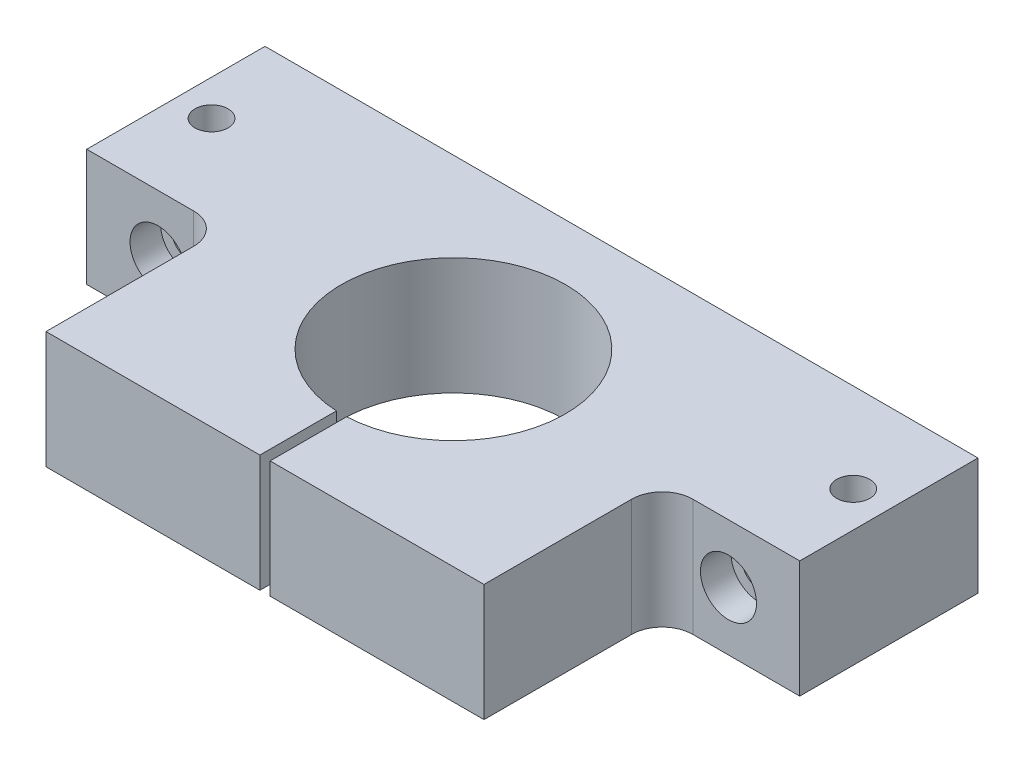
ISO-10303-21;
HEADER;
FILE_DESCRIPTION(('STEP AP214'),'2;1');
FILE_NAME('part.step','',(''),(''),'','','');
FILE_SCHEMA(('AUTOMOTIVE_DESIGN { 1 0 10303 214 1 1 1 1 }'));
ENDSEC;
DATA;
#1=APPLICATION_CONTEXT('core data for automotive mechanical design processes');
#2=APPLICATION_PROTOCOL_DEFINITION('international standard','automotive_design',2000,#1);
#3=PRODUCT_CONTEXT('',#1,'mechanical');
#4=PRODUCT('Part','Part','',(#3));
#5=PRODUCT_RELATED_PRODUCT_CATEGORY('part','',(#4));
#6=PRODUCT_DEFINITION_FORMATION('','',#4);
#7=PRODUCT_DEFINITION_CONTEXT('part definition',#1,'design');
#8=PRODUCT_DEFINITION('design','',#6,#7);
#9=PRODUCT_DEFINITION_SHAPE('','',#8);
#10=(LENGTH_UNIT() NAMED_UNIT(*) SI_UNIT(.MILLI.,.METRE.));
#11=(NAMED_UNIT(*) PLANE_ANGLE_UNIT() SI_UNIT($,.RADIAN.));
#12=(NAMED_UNIT(*) SI_UNIT($,.STERADIAN.) SOLID_ANGLE_UNIT());
#13=UNCERTAINTY_MEASURE_WITH_UNIT(LENGTH_MEASURE(1.E-05),#10,'distance_accuracy_value','');
#14=(GEOMETRIC_REPRESENTATION_CONTEXT(3) GLOBAL_UNCERTAINTY_ASSIGNED_CONTEXT((#13)) GLOBAL_UNIT_ASSIGNED_CONTEXT((#10,
#11,#12)) REPRESENTATION_CONTEXT('',''));
#15=CARTESIAN_POINT('',(0.,0.,0.));
#16=DIRECTION('',(0.,0.,1.));
#17=DIRECTION('',(1.,0.,0.));
#18=AXIS2_PLACEMENT_3D('',#15,#16,#17);
#19=CARTESIAN_POINT('',(69.,23.,0.));
#20=DIRECTION('',(1.,0.,0.));
#21=DIRECTION('',(0.,0.,-1.));
#22=AXIS2_PLACEMENT_3D('',#19,#20,#21);
#23=PLANE('',#22);
#24=DIRECTION('',(0.,0.,1.));
#25=VECTOR('',#24,1.);
#26=CARTESIAN_POINT('',(69.,0.,0.));
#27=LINE('',#26,#25);
#28=CARTESIAN_POINT('',(69.,0.,54.9772609758359));
#29=VERTEX_POINT('',#28);
#30=CARTESIAN_POINT('',(69.,0.,70.));
#31=VERTEX_POINT('',#30);
#32=EDGE_CURVE('E174',#29,#31,#27,.T.);
#33=ORIENTED_EDGE('',*,*,#32,.F.);
#34=DIRECTION('',(0.,-1.,0.));
#35=VECTOR('',#34,1.);
#36=CARTESIAN_POINT('',(69.,23.,54.9772609758359));
#37=LINE('',#36,#35);
#38=CARTESIAN_POINT('',(69.,23.,54.9772609758359));
#39=VERTEX_POINT('',#38);
#40=EDGE_CURVE('E200',#39,#29,#37,.T.);
#41=ORIENTED_EDGE('',*,*,#40,.F.);
#42=DIRECTION('',(0.,0.,1.));
#43=VECTOR('',#42,1.);
#44=CARTESIAN_POINT('',(69.,23.,0.));
#45=LINE('',#44,#43);
#46=CARTESIAN_POINT('',(69.,23.,70.));
#47=VERTEX_POINT('',#46);
#48=EDGE_CURVE('E197',#39,#47,#45,.T.);
#49=ORIENTED_EDGE('',*,*,#48,.T.);
#50=DIRECTION('',(0.,-1.,0.));
#51=VECTOR('',#50,1.);
#52=CARTESIAN_POINT('',(69.,23.,70.));
#53=LINE('',#52,#51);
#54=EDGE_CURVE('E230',#47,#31,#53,.T.);
#55=ORIENTED_EDGE('',*,*,#54,.T.);
#56=EDGE_LOOP('',(#33,#41,#49,#55));
#57=FACE_BOUND('',#56,.T.);
#58=CARTESIAN_POINT('',(69.,11.5,63.));
#59=DIRECTION('',(1.,0.,0.));
#60=DIRECTION('',(0.,0.,-1.));
#61=AXIS2_PLACEMENT_3D('',#58,#59,#60);
#62=CIRCLE('',#61,3.24999999999999);
#63=CARTESIAN_POINT('',(69.,11.5,59.75));
#64=VERTEX_POINT('',#63);
#65=EDGE_CURVE('E154',#64,#64,#62,.F.);
#66=ORIENTED_EDGE('',*,*,#65,.T.);
#67=EDGE_LOOP('',(#66));
#68=FACE_BOUND('',#67,.T.);
#69=ADVANCED_FACE('F38',(#57,#68),#23,.T.);
#70=CARTESIAN_POINT('',(70.,23.,33.));
#71=DIRECTION('',(0.,-1.,0.));
#72=DIRECTION('',(0.,0.,-1.));
#73=AXIS2_PLACEMENT_3D('',#70,#71,#72);
#74=CYLINDRICAL_SURFACE('',#73,22.);
#75=CARTESIAN_POINT('',(70.,0.,33.));
#76=DIRECTION('',(0.,1.,0.));
#77=DIRECTION('',(0.,0.,1.));
#78=AXIS2_PLACEMENT_3D('',#75,#76,#77);
#79=CIRCLE('',#78,22.);
#80=CARTESIAN_POINT('',(71.,0.,54.9772609758359));
#81=VERTEX_POINT('',#80);
#82=EDGE_CURVE('E166',#81,#29,#79,.T.);
#83=ORIENTED_EDGE('',*,*,#82,.F.);
#84=DIRECTION('',(0.,-1.,0.));
#85=VECTOR('',#84,1.);
#86=CARTESIAN_POINT('',(71.,23.,54.9772609758359));
#87=LINE('',#86,#85);
#88=CARTESIAN_POINT('',(71.,23.,54.9772609758359));
#89=VERTEX_POINT('',#88);
#90=EDGE_CURVE('E251',#89,#81,#87,.T.);
#91=ORIENTED_EDGE('',*,*,#90,.F.);
#92=CARTESIAN_POINT('',(70.,23.,33.));
#93=DIRECTION('',(0.,1.,0.));
#94=DIRECTION('',(0.,0.,1.));
#95=AXIS2_PLACEMENT_3D('',#92,#93,#94);
#96=CIRCLE('',#95,22.);
#97=EDGE_CURVE('E170',#89,#39,#96,.T.);
#98=ORIENTED_EDGE('',*,*,#97,.T.);
#99=ORIENTED_EDGE('',*,*,#40,.T.);
#100=EDGE_LOOP('',(#83,#91,#98,#99));
#101=FACE_BOUND('',#100,.T.);
#102=ADVANCED_FACE('F295',(#101),#74,.F.);
#103=CARTESIAN_POINT('',(70.9999999999999,23.,0.));
#104=DIRECTION('',(1.,0.,0.));
#105=DIRECTION('',(0.,0.,-1.));
#106=AXIS2_PLACEMENT_3D('',#103,#104,#105);
#107=PLANE('',#106);
#108=CARTESIAN_POINT('',(70.9999999999999,11.5,62.9999999999999));
#109=DIRECTION('',(-1.,0.,0.));
#110=DIRECTION('',(0.,0.,1.));
#111=AXIS2_PLACEMENT_3D('',#108,#109,#110);
#112=CIRCLE('',#111,2.5);
#113=CARTESIAN_POINT('',(70.9999999999999,11.5,65.4999999999999));
#114=VERTEX_POINT('',#113);
#115=EDGE_CURVE('E151',#114,#114,#112,.T.);
#116=ORIENTED_EDGE('',*,*,#115,.F.);
#117=EDGE_LOOP('',(#116));
#118=FACE_BOUND('',#117,.T.);
#119=DIRECTION('',(0.,0.,1.));
#120=VECTOR('',#119,1.);
#121=CARTESIAN_POINT('',(70.9999999999999,0.,0.));
#122=LINE('',#121,#120);
#123=CARTESIAN_POINT('',(71.,0.,70.));
#124=VERTEX_POINT('',#123);
#125=EDGE_CURVE('E203',#81,#124,#122,.T.);
#126=ORIENTED_EDGE('',*,*,#125,.T.);
#127=DIRECTION('',(0.,-1.,0.));
#128=VECTOR('',#127,1.);
#129=CARTESIAN_POINT('',(71.,23.,70.));
#130=LINE('',#129,#128);
#131=CARTESIAN_POINT('',(71.,23.,70.));
#132=VERTEX_POINT('',#131);
#133=EDGE_CURVE('E248',#132,#124,#130,.T.);
#134=ORIENTED_EDGE('',*,*,#133,.F.);
#135=DIRECTION('',(0.,0.,1.));
#136=VECTOR('',#135,1.);
#137=CARTESIAN_POINT('',(70.9999999999999,23.,0.));
#138=LINE('',#137,#136);
#139=EDGE_CURVE('E173',#89,#132,#138,.T.);
#140=ORIENTED_EDGE('',*,*,#139,.F.);
#141=ORIENTED_EDGE('',*,*,#90,.T.);
#142=EDGE_LOOP('',(#126,#134,#140,#141));
#143=FACE_BOUND('',#142,.T.);
#144=ADVANCED_FACE('F340',(#118,#143),#107,.F.);
#145=CARTESIAN_POINT('',(0.,23.,70.));
#146=DIRECTION('',(0.,0.,-1.));
#147=DIRECTION('',(-1.,0.,0.));
#148=AXIS2_PLACEMENT_3D('',#145,#146,#147);
#149=PLANE('',#148);
#150=DIRECTION('',(1.,0.,0.));
#151=VECTOR('',#150,1.);
#152=CARTESIAN_POINT('',(0.,0.,70.));
#153=LINE('',#152,#151);
#154=CARTESIAN_POINT('',(113.,0.,70.));
#155=VERTEX_POINT('',#154);
#156=EDGE_CURVE('E205',#124,#155,#153,.T.);
#157=ORIENTED_EDGE('',*,*,#156,.T.);
#158=DIRECTION('',(0.,-1.,0.));
#159=VECTOR('',#158,1.);
#160=CARTESIAN_POINT('',(113.,23.,70.));
#161=LINE('',#160,#159);
#162=CARTESIAN_POINT('',(113.,23.,70.));
#163=VERTEX_POINT('',#162);
#164=EDGE_CURVE('E245',#163,#155,#161,.T.);
#165=ORIENTED_EDGE('',*,*,#164,.F.);
#166=DIRECTION('',(1.,0.,0.));
#167=VECTOR('',#166,1.);
#168=CARTESIAN_POINT('',(0.,23.,70.));
#169=LINE('',#168,#167);
#170=EDGE_CURVE('E176',#132,#163,#169,.T.);
#171=ORIENTED_EDGE('',*,*,#170,.F.);
#172=ORIENTED_EDGE('',*,*,#133,.T.);
#173=EDGE_LOOP('',(#157,#165,#171,#172));
#174=FACE_BOUND('',#173,.T.);
#175=ADVANCED_FACE('F288',(#174),#149,.F.);
#176=CARTESIAN_POINT('',(113.,23.,0.));
#177=DIRECTION('',(-1.,0.,0.));
#178=DIRECTION('',(0.,0.,1.));
#179=AXIS2_PLACEMENT_3D('',#176,#177,#178);
#180=PLANE('',#179);
#181=DIRECTION('',(0.,0.,-1.));
#182=VECTOR('',#181,1.);
#183=CARTESIAN_POINT('',(113.,0.,0.));
#184=LINE('',#183,#182);
#185=CARTESIAN_POINT('',(113.,0.,41.));
#186=VERTEX_POINT('',#185);
#187=EDGE_CURVE('E207',#155,#186,#184,.T.);
#188=ORIENTED_EDGE('',*,*,#187,.T.);
#189=DIRECTION('',(0.,-1.,0.));
#190=VECTOR('',#189,1.);
#191=CARTESIAN_POINT('',(113.,23.,41.));
#192=LINE('',#191,#190);
#193=CARTESIAN_POINT('',(113.,23.,41.));
#194=VERTEX_POINT('',#193);
#195=EDGE_CURVE('E256',#186,#194,#192,.F.);
#196=ORIENTED_EDGE('',*,*,#195,.T.);
#197=DIRECTION('',(0.,0.,-1.));
#198=VECTOR('',#197,1.);
#199=CARTESIAN_POINT('',(113.,23.,0.));
#200=LINE('',#199,#198);
#201=EDGE_CURVE('E178',#163,#194,#200,.T.);
#202=ORIENTED_EDGE('',*,*,#201,.F.);
#203=ORIENTED_EDGE('',*,*,#164,.T.);
#204=EDGE_LOOP('',(#188,#196,#202,#203));
#205=FACE_BOUND('',#204,.T.);
#206=ADVANCED_FACE('F284',(#205),#180,.F.);
#207=CARTESIAN_POINT('',(0.,23.,35.));
#208=DIRECTION('',(0.,0.,-1.));
#209=DIRECTION('',(-1.,0.,0.));
#210=AXIS2_PLACEMENT_3D('',#207,#208,#209);
#211=PLANE('',#210);
#212=CARTESIAN_POINT('',(126.,11.5,35.));
#213=DIRECTION('',(0.,0.,1.));
#214=DIRECTION('',(1.,0.,0.));
#215=AXIS2_PLACEMENT_3D('',#212,#213,#214);
#216=CIRCLE('',#215,5.50000000000001);
#217=CARTESIAN_POINT('',(131.5,11.5,35.));
#218=VERTEX_POINT('',#217);
#219=EDGE_CURVE('E680',#218,#218,#216,.T.);
#220=ORIENTED_EDGE('',*,*,#219,.F.);
#221=EDGE_LOOP('',(#220));
#222=FACE_BOUND('',#221,.T.);
#223=DIRECTION('',(1.,0.,0.));
#224=VECTOR('',#223,1.);
#225=CARTESIAN_POINT('',(0.,23.,35.));
#226=LINE('',#225,#224);
#227=CARTESIAN_POINT('',(119.,23.,35.));
#228=VERTEX_POINT('',#227);
#229=CARTESIAN_POINT('',(140.,23.,35.));
#230=VERTEX_POINT('',#229);
#231=EDGE_CURVE('E181',#228,#230,#226,.T.);
#232=ORIENTED_EDGE('',*,*,#231,.F.);
#233=DIRECTION('',(0.,-1.,0.));
#234=VECTOR('',#233,1.);
#235=CARTESIAN_POINT('',(119.,0.,35.));
#236=LINE('',#235,#234);
#237=CARTESIAN_POINT('',(119.,0.,35.));
#238=VERTEX_POINT('',#237);
#239=EDGE_CURVE('E253',#228,#238,#236,.T.);
#240=ORIENTED_EDGE('',*,*,#239,.T.);
#241=DIRECTION('',(1.,0.,0.));
#242=VECTOR('',#241,1.);
#243=CARTESIAN_POINT('',(0.,0.,35.));
#244=LINE('',#243,#242);
#245=CARTESIAN_POINT('',(140.,0.,35.));
#246=VERTEX_POINT('',#245);
#247=EDGE_CURVE('E210',#238,#246,#244,.T.);
#248=ORIENTED_EDGE('',*,*,#247,.T.);
#249=DIRECTION('',(0.,-1.,0.));
#250=VECTOR('',#249,1.);
#251=CARTESIAN_POINT('',(140.,23.,35.));
#252=LINE('',#251,#250);
#253=EDGE_CURVE('E242',#230,#246,#252,.T.);
#254=ORIENTED_EDGE('',*,*,#253,.F.);
#255=EDGE_LOOP('',(#232,#240,#248,#254));
#256=FACE_BOUND('',#255,.T.);
#257=ADVANCED_FACE('F277',(#222,#256),#211,.F.);
#258=CARTESIAN_POINT('',(140.,23.,0.));
#259=DIRECTION('',(1.,0.,0.));
#260=DIRECTION('',(0.,0.,-1.));
#261=AXIS2_PLACEMENT_3D('',#258,#259,#260);
#262=PLANE('',#261);
#263=DIRECTION('',(0.,0.,1.));
#264=VECTOR('',#263,1.);
#265=CARTESIAN_POINT('',(140.,0.,0.));
#266=LINE('',#265,#264);
#267=CARTESIAN_POINT('',(140.,0.,0.));
#268=VERTEX_POINT('',#267);
#269=EDGE_CURVE('E212',#268,#246,#266,.T.);
#270=ORIENTED_EDGE('',*,*,#269,.F.);
#271=DIRECTION('',(0.,-1.,0.));
#272=VECTOR('',#271,1.);
#273=CARTESIAN_POINT('',(140.,23.,0.));
#274=LINE('',#273,#272);
#275=CARTESIAN_POINT('',(140.,23.,0.));
#276=VERTEX_POINT('',#275);
#277=EDGE_CURVE('E240',#276,#268,#274,.T.);
#278=ORIENTED_EDGE('',*,*,#277,.F.);
#279=DIRECTION('',(0.,0.,1.));
#280=VECTOR('',#279,1.);
#281=CARTESIAN_POINT('',(140.,23.,0.));
#282=LINE('',#281,#280);
#283=EDGE_CURVE('E183',#276,#230,#282,.T.);
#284=ORIENTED_EDGE('',*,*,#283,.T.);
#285=ORIENTED_EDGE('',*,*,#253,.T.);
#286=EDGE_LOOP('',(#270,#278,#284,#285));
#287=FACE_BOUND('',#286,.T.);
#288=ADVANCED_FACE('F323',(#287),#262,.T.);
#289=CARTESIAN_POINT('',(0.,23.,0.));
#290=DIRECTION('',(0.,0.,-1.));
#291=DIRECTION('',(-1.,0.,0.));
#292=AXIS2_PLACEMENT_3D('',#289,#290,#291);
#293=PLANE('',#292);
#294=CARTESIAN_POINT('',(14.,11.5,0.));
#295=DIRECTION('',(0.,0.,1.));
#296=DIRECTION('',(1.,0.,0.));
#297=AXIS2_PLACEMENT_3D('',#294,#295,#296);
#298=CIRCLE('',#297,3.29999999999999);
#299=CARTESIAN_POINT('',(17.3,11.5,0.));
#300=VERTEX_POINT('',#299);
#301=EDGE_CURVE('E677',#300,#300,#298,.T.);
#302=ORIENTED_EDGE('',*,*,#301,.T.);
#303=EDGE_LOOP('',(#302));
#304=FACE_BOUND('',#303,.T.);
#305=CARTESIAN_POINT('',(126.,11.5,0.));
#306=DIRECTION('',(0.,0.,1.));
#307=DIRECTION('',(1.,0.,0.));
#308=AXIS2_PLACEMENT_3D('',#305,#306,#307);
#309=CIRCLE('',#308,3.3);
#310=CARTESIAN_POINT('',(129.3,11.5,0.));
#311=VERTEX_POINT('',#310);
#312=EDGE_CURVE('E157',#311,#311,#309,.T.);
#313=ORIENTED_EDGE('',*,*,#312,.T.);
#314=EDGE_LOOP('',(#313));
#315=FACE_BOUND('',#314,.T.);
#316=DIRECTION('',(1.,0.,0.));
#317=VECTOR('',#316,1.);
#318=CARTESIAN_POINT('',(0.,0.,0.));
#319=LINE('',#318,#317);
#320=CARTESIAN_POINT('',(0.,0.,0.));
#321=VERTEX_POINT('',#320);
#322=EDGE_CURVE('E215',#321,#268,#319,.T.);
#323=ORIENTED_EDGE('',*,*,#322,.F.);
#324=DIRECTION('',(0.,-1.,0.));
#325=VECTOR('',#324,1.);
#326=CARTESIAN_POINT('',(0.,23.,0.));
#327=LINE('',#326,#325);
#328=CARTESIAN_POINT('',(0.,23.,0.));
#329=VERTEX_POINT('',#328);
#330=EDGE_CURVE('E238',#329,#321,#327,.T.);
#331=ORIENTED_EDGE('',*,*,#330,.F.);
#332=DIRECTION('',(1.,0.,0.));
#333=VECTOR('',#332,1.);
#334=CARTESIAN_POINT('',(0.,23.,0.));
#335=LINE('',#334,#333);
#336=EDGE_CURVE('E186',#329,#276,#335,.T.);
#337=ORIENTED_EDGE('',*,*,#336,.T.);
#338=ORIENTED_EDGE('',*,*,#277,.T.);
#339=EDGE_LOOP('',(#323,#331,#337,#338));
#340=FACE_BOUND('',#339,.T.);
#341=ADVANCED_FACE('F320',(#304,#315,#340),#293,.T.);
#342=CARTESIAN_POINT('',(0.,23.,0.));
#343=DIRECTION('',(1.,0.,0.));
#344=DIRECTION('',(0.,0.,-1.));
#345=AXIS2_PLACEMENT_3D('',#342,#343,#344);
#346=PLANE('',#345);
#347=DIRECTION('',(0.,0.,1.));
#348=VECTOR('',#347,1.);
#349=CARTESIAN_POINT('',(0.,0.,0.));
#350=LINE('',#349,#348);
#351=CARTESIAN_POINT('',(0.,0.,35.));
#352=VERTEX_POINT('',#351);
#353=EDGE_CURVE('E218',#321,#352,#350,.T.);
#354=ORIENTED_EDGE('',*,*,#353,.T.);
#355=DIRECTION('',(0.,-1.,0.));
#356=VECTOR('',#355,1.);
#357=CARTESIAN_POINT('',(0.,23.,35.));
#358=LINE('',#357,#356);
#359=CARTESIAN_POINT('',(0.,23.,35.));
#360=VERTEX_POINT('',#359);
#361=EDGE_CURVE('E235',#360,#352,#358,.T.);
#362=ORIENTED_EDGE('',*,*,#361,.F.);
#363=DIRECTION('',(0.,0.,1.));
#364=VECTOR('',#363,1.);
#365=CARTESIAN_POINT('',(0.,23.,0.));
#366=LINE('',#365,#364);
#367=EDGE_CURVE('E189',#329,#360,#366,.T.);
#368=ORIENTED_EDGE('',*,*,#367,.F.);
#369=ORIENTED_EDGE('',*,*,#330,.T.);
#370=EDGE_LOOP('',(#354,#362,#368,#369));
#371=FACE_BOUND('',#370,.T.);
#372=ADVANCED_FACE('F330',(#371),#346,.F.);
#373=CARTESIAN_POINT('',(0.,23.,35.));
#374=DIRECTION('',(0.,0.,-1.));
#375=DIRECTION('',(-1.,0.,0.));
#376=AXIS2_PLACEMENT_3D('',#373,#374,#375);
#377=PLANE('',#376);
#378=CARTESIAN_POINT('',(14.,11.5,35.));
#379=DIRECTION('',(0.,0.,1.));
#380=DIRECTION('',(1.,0.,0.));
#381=AXIS2_PLACEMENT_3D('',#378,#379,#380);
#382=CIRCLE('',#381,5.49999999999999);
#383=CARTESIAN_POINT('',(19.5,11.5,35.));
#384=VERTEX_POINT('',#383);
#385=EDGE_CURVE('E668',#384,#384,#382,.T.);
#386=ORIENTED_EDGE('',*,*,#385,.F.);
#387=EDGE_LOOP('',(#386));
#388=FACE_BOUND('',#387,.T.);
#389=DIRECTION('',(1.,0.,0.));
#390=VECTOR('',#389,1.);
#391=CARTESIAN_POINT('',(0.,0.,35.));
#392=LINE('',#391,#390);
#393=CARTESIAN_POINT('',(21.,0.,35.));
#394=VERTEX_POINT('',#393);
#395=EDGE_CURVE('E220',#352,#394,#392,.T.);
#396=ORIENTED_EDGE('',*,*,#395,.T.);
#397=DIRECTION('',(0.,-1.,0.));
#398=VECTOR('',#397,1.);
#399=CARTESIAN_POINT('',(21.,23.,35.));
#400=LINE('',#399,#398);
#401=CARTESIAN_POINT('',(21.,23.,35.));
#402=VERTEX_POINT('',#401);
#403=EDGE_CURVE('E53',#394,#402,#400,.F.);
#404=ORIENTED_EDGE('',*,*,#403,.T.);
#405=DIRECTION('',(1.,0.,0.));
#406=VECTOR('',#405,1.);
#407=CARTESIAN_POINT('',(0.,23.,35.));
#408=LINE('',#407,#406);
#409=EDGE_CURVE('E191',#360,#402,#408,.T.);
#410=ORIENTED_EDGE('',*,*,#409,.F.);
#411=ORIENTED_EDGE('',*,*,#361,.T.);
#412=EDGE_LOOP('',(#396,#404,#410,#411));
#413=FACE_BOUND('',#412,.T.);
#414=ADVANCED_FACE('F315',(#388,#413),#377,.F.);
#415=CARTESIAN_POINT('',(27.,23.,0.));
#416=DIRECTION('',(1.,0.,0.));
#417=DIRECTION('',(0.,0.,-1.));
#418=AXIS2_PLACEMENT_3D('',#415,#416,#417);
#419=PLANE('',#418);
#420=CARTESIAN_POINT('',(27.,11.5,63.));
#421=DIRECTION('',(-1.,0.,0.));
#422=DIRECTION('',(0.,0.,1.));
#423=AXIS2_PLACEMENT_3D('',#420,#421,#422);
#424=CIRCLE('',#423,5.5);
#425=CARTESIAN_POINT('',(27.,11.5,68.5));
#426=VERTEX_POINT('',#425);
#427=EDGE_CURVE('E150',#426,#426,#424,.T.);
#428=ORIENTED_EDGE('',*,*,#427,.F.);
#429=EDGE_LOOP('',(#428));
#430=FACE_BOUND('',#429,.T.);
#431=DIRECTION('',(0.,0.,1.));
#432=VECTOR('',#431,1.);
#433=CARTESIAN_POINT('',(27.,23.,0.));
#434=LINE('',#433,#432);
#435=CARTESIAN_POINT('',(27.,23.,41.));
#436=VERTEX_POINT('',#435);
#437=CARTESIAN_POINT('',(27.,23.,70.));
#438=VERTEX_POINT('',#437);
#439=EDGE_CURVE('E193',#436,#438,#434,.T.);
#440=ORIENTED_EDGE('',*,*,#439,.F.);
#441=DIRECTION('',(0.,-1.,0.));
#442=VECTOR('',#441,1.);
#443=CARTESIAN_POINT('',(27.,0.,41.));
#444=LINE('',#443,#442);
#445=CARTESIAN_POINT('',(27.,0.,41.));
#446=VERTEX_POINT('',#445);
#447=EDGE_CURVE('E258',#436,#446,#444,.T.);
#448=ORIENTED_EDGE('',*,*,#447,.T.);
#449=DIRECTION('',(0.,0.,1.));
#450=VECTOR('',#449,1.);
#451=CARTESIAN_POINT('',(27.,0.,0.));
#452=LINE('',#451,#450);
#453=CARTESIAN_POINT('',(27.,0.,70.));
#454=VERTEX_POINT('',#453);
#455=EDGE_CURVE('E222',#446,#454,#452,.T.);
#456=ORIENTED_EDGE('',*,*,#455,.T.);
#457=DIRECTION('',(0.,-1.,0.));
#458=VECTOR('',#457,1.);
#459=CARTESIAN_POINT('',(27.,23.,70.));
#460=LINE('',#459,#458);
#461=EDGE_CURVE('E232',#438,#454,#460,.T.);
#462=ORIENTED_EDGE('',*,*,#461,.F.);
#463=EDGE_LOOP('',(#440,#448,#456,#462));
#464=FACE_BOUND('',#463,.T.);
#465=ADVANCED_FACE('F308',(#430,#464),#419,.F.);
#466=CARTESIAN_POINT('',(0.,23.,70.));
#467=DIRECTION('',(0.,0.,-1.));
#468=DIRECTION('',(-1.,0.,0.));
#469=AXIS2_PLACEMENT_3D('',#466,#467,#468);
#470=PLANE('',#469);
#471=DIRECTION('',(1.,0.,0.));
#472=VECTOR('',#471,1.);
#473=CARTESIAN_POINT('',(0.,0.,70.));
#474=LINE('',#473,#472);
#475=EDGE_CURVE('E224',#454,#31,#474,.T.);
#476=ORIENTED_EDGE('',*,*,#475,.T.);
#477=ORIENTED_EDGE('',*,*,#54,.F.);
#478=DIRECTION('',(1.,0.,0.));
#479=VECTOR('',#478,1.);
#480=CARTESIAN_POINT('',(0.,23.,70.));
#481=LINE('',#480,#479);
#482=EDGE_CURVE('E195',#438,#47,#481,.T.);
#483=ORIENTED_EDGE('',*,*,#482,.F.);
#484=ORIENTED_EDGE('',*,*,#461,.T.);
#485=EDGE_LOOP('',(#476,#477,#483,#484));
#486=FACE_BOUND('',#485,.T.);
#487=ADVANCED_FACE('F303',(#486),#470,.F.);
#488=CARTESIAN_POINT('',(0.,23.,0.));
#489=DIRECTION('',(0.,1.,0.));
#490=DIRECTION('',(0.,0.,1.));
#491=AXIS2_PLACEMENT_3D('',#488,#489,#490);
#492=PLANE('',#491);
#493=CARTESIAN_POINT('',(7.,23.,17.5));
#494=DIRECTION('',(0.,-1.,0.));
#495=DIRECTION('',(0.,0.,-1.));
#496=AXIS2_PLACEMENT_3D('',#493,#494,#495);
#497=CIRCLE('',#496,3.25);
#498=CARTESIAN_POINT('',(7.,23.,14.25));
#499=VERTEX_POINT('',#498);
#500=EDGE_CURVE('E653',#499,#499,#497,.T.);
#501=ORIENTED_EDGE('',*,*,#500,.T.);
#502=EDGE_LOOP('',(#501));
#503=FACE_BOUND('',#502,.T.);
#504=CARTESIAN_POINT('',(133.,23.,17.5));
#505=DIRECTION('',(0.,-1.,0.));
#506=DIRECTION('',(0.,0.,-1.));
#507=AXIS2_PLACEMENT_3D('',#504,#505,#506);
#508=CIRCLE('',#507,3.25);
#509=CARTESIAN_POINT('',(133.,23.,14.25));
#510=VERTEX_POINT('',#509);
#511=EDGE_CURVE('E665',#510,#510,#508,.T.);
#512=ORIENTED_EDGE('',*,*,#511,.T.);
#513=EDGE_LOOP('',(#512));
#514=FACE_BOUND('',#513,.T.);
#515=ORIENTED_EDGE('',*,*,#97,.F.);
#516=ORIENTED_EDGE('',*,*,#139,.T.);
#517=ORIENTED_EDGE('',*,*,#170,.T.);
#518=ORIENTED_EDGE('',*,*,#201,.T.);
#519=CARTESIAN_POINT('',(119.,23.,41.));
#520=DIRECTION('',(0.,1.,0.));
#521=DIRECTION('',(0.,0.,1.));
#522=AXIS2_PLACEMENT_3D('',#519,#520,#521);
#523=CIRCLE('',#522,6.);
#524=EDGE_CURVE('E264',#194,#228,#523,.F.);
#525=ORIENTED_EDGE('',*,*,#524,.T.);
#526=ORIENTED_EDGE('',*,*,#231,.T.);
#527=ORIENTED_EDGE('',*,*,#283,.F.);
#528=ORIENTED_EDGE('',*,*,#336,.F.);
#529=ORIENTED_EDGE('',*,*,#367,.T.);
#530=ORIENTED_EDGE('',*,*,#409,.T.);
#531=CARTESIAN_POINT('',(21.,23.,41.));
#532=DIRECTION('',(0.,1.,0.));
#533=DIRECTION('',(0.,0.,1.));
#534=AXIS2_PLACEMENT_3D('',#531,#532,#533);
#535=CIRCLE('',#534,6.);
#536=EDGE_CURVE('E11',#402,#436,#535,.F.);
#537=ORIENTED_EDGE('',*,*,#536,.T.);
#538=ORIENTED_EDGE('',*,*,#439,.T.);
#539=ORIENTED_EDGE('',*,*,#482,.T.);
#540=ORIENTED_EDGE('',*,*,#48,.F.);
#541=EDGE_LOOP('',(#515,#516,#517,#518,#525,#526,#527,#528,#529,#530,#537,#538,#539,#540));
#542=FACE_BOUND('',#541,.T.);
#543=ADVANCED_FACE('F269',(#503,#514,#542),#492,.T.);
#544=CARTESIAN_POINT('',(0.,0.,0.));
#545=DIRECTION('',(0.,1.,0.));
#546=DIRECTION('',(0.,0.,1.));
#547=AXIS2_PLACEMENT_3D('',#544,#545,#546);
#548=PLANE('',#547);
#549=CARTESIAN_POINT('',(7.,0.,17.5));
#550=DIRECTION('',(0.,-1.,0.));
#551=DIRECTION('',(0.,0.,-1.));
#552=AXIS2_PLACEMENT_3D('',#549,#550,#551);
#553=CIRCLE('',#552,5.5);
#554=CARTESIAN_POINT('',(7.,0.,12.));
#555=VERTEX_POINT('',#554);
#556=EDGE_CURVE('E646',#555,#555,#553,.T.);
#557=ORIENTED_EDGE('',*,*,#556,.F.);
#558=EDGE_LOOP('',(#557));
#559=FACE_BOUND('',#558,.T.);
#560=CARTESIAN_POINT('',(133.,0.,17.5));
#561=DIRECTION('',(0.,-1.,0.));
#562=DIRECTION('',(0.,0.,-1.));
#563=AXIS2_PLACEMENT_3D('',#560,#561,#562);
#564=CIRCLE('',#563,5.50000000000001);
#565=CARTESIAN_POINT('',(133.,0.,12.));
#566=VERTEX_POINT('',#565);
#567=EDGE_CURVE('E656',#566,#566,#564,.T.);
#568=ORIENTED_EDGE('',*,*,#567,.F.);
#569=EDGE_LOOP('',(#568));
#570=FACE_BOUND('',#569,.T.);
#571=ORIENTED_EDGE('',*,*,#82,.T.);
#572=ORIENTED_EDGE('',*,*,#32,.T.);
#573=ORIENTED_EDGE('',*,*,#475,.F.);
#574=ORIENTED_EDGE('',*,*,#455,.F.);
#575=CARTESIAN_POINT('',(21.,0.,41.));
#576=DIRECTION('',(0.,1.,0.));
#577=DIRECTION('',(0.,0.,1.));
#578=AXIS2_PLACEMENT_3D('',#575,#576,#577);
#579=CIRCLE('',#578,6.);
#580=EDGE_CURVE('E46',#446,#394,#579,.T.);
#581=ORIENTED_EDGE('',*,*,#580,.T.);
#582=ORIENTED_EDGE('',*,*,#395,.F.);
#583=ORIENTED_EDGE('',*,*,#353,.F.);
#584=ORIENTED_EDGE('',*,*,#322,.T.);
#585=ORIENTED_EDGE('',*,*,#269,.T.);
#586=ORIENTED_EDGE('',*,*,#247,.F.);
#587=CARTESIAN_POINT('',(119.,0.,41.));
#588=DIRECTION('',(0.,1.,0.));
#589=DIRECTION('',(0.,0.,1.));
#590=AXIS2_PLACEMENT_3D('',#587,#588,#589);
#591=CIRCLE('',#590,6.);
#592=EDGE_CURVE('E262',#238,#186,#591,.T.);
#593=ORIENTED_EDGE('',*,*,#592,.T.);
#594=ORIENTED_EDGE('',*,*,#187,.F.);
#595=ORIENTED_EDGE('',*,*,#156,.F.);
#596=ORIENTED_EDGE('',*,*,#125,.F.);
#597=EDGE_LOOP('',(#571,#572,#573,#574,#581,#582,#583,#584,#585,#586,#593,#594,#595,#596));
#598=FACE_BOUND('',#597,.T.);
#599=ADVANCED_FACE('F281',(#559,#570,#598),#548,.F.);
#600=CARTESIAN_POINT('',(119.,23.,41.));
#601=DIRECTION('',(0.,1.,0.));
#602=DIRECTION('',(0.,0.,1.));
#603=AXIS2_PLACEMENT_3D('',#600,#601,#602);
#604=CYLINDRICAL_SURFACE('',#603,6.);
#605=ORIENTED_EDGE('',*,*,#524,.F.);
#606=ORIENTED_EDGE('',*,*,#195,.F.);
#607=ORIENTED_EDGE('',*,*,#592,.F.);
#608=ORIENTED_EDGE('',*,*,#239,.F.);
#609=EDGE_LOOP('',(#605,#606,#607,#608));
#610=FACE_BOUND('',#609,.T.);
#611=ADVANCED_FACE('F279',(#610),#604,.F.);
#612=CARTESIAN_POINT('',(21.,23.,41.));
#613=DIRECTION('',(0.,1.,0.));
#614=DIRECTION('',(0.,0.,1.));
#615=AXIS2_PLACEMENT_3D('',#612,#613,#614);
#616=CYLINDRICAL_SURFACE('',#615,6.);
#617=ORIENTED_EDGE('',*,*,#536,.F.);
#618=ORIENTED_EDGE('',*,*,#403,.F.);
#619=ORIENTED_EDGE('',*,*,#580,.F.);
#620=ORIENTED_EDGE('',*,*,#447,.F.);
#621=EDGE_LOOP('',(#617,#618,#619,#620));
#622=FACE_BOUND('',#621,.T.);
#623=ADVANCED_FACE('F40',(#622),#616,.F.);
#624=CARTESIAN_POINT('',(27.,11.5,63.));
#625=DIRECTION('',(-1.,0.,0.));
#626=DIRECTION('',(0.,0.,1.));
#627=AXIS2_PLACEMENT_3D('',#624,#625,#626);
#628=CYLINDRICAL_SURFACE('',#627,3.24999999999999);
#629=ORIENTED_EDGE('',*,*,#65,.F.);
#630=EDGE_LOOP('',(#629));
#631=FACE_BOUND('',#630,.T.);
#632=CARTESIAN_POINT('',(34.,11.5,63.));
#633=DIRECTION('',(-1.,0.,0.));
#634=DIRECTION('',(0.,0.,1.));
#635=AXIS2_PLACEMENT_3D('',#632,#633,#634);
#636=CIRCLE('',#635,3.25);
#637=CARTESIAN_POINT('',(34.,11.5,66.25));
#638=VERTEX_POINT('',#637);
#639=EDGE_CURVE('E161',#638,#638,#636,.T.);
#640=ORIENTED_EDGE('',*,*,#639,.T.);
#641=EDGE_LOOP('',(#640));
#642=FACE_BOUND('',#641,.T.);
#643=ADVANCED_FACE('F398',(#631,#642),#628,.F.);
#644=CARTESIAN_POINT('',(34.,14.75,63.));
#645=DIRECTION('',(1.,0.,0.));
#646=DIRECTION('',(0.,0.,-1.));
#647=AXIS2_PLACEMENT_3D('',#644,#645,#646);
#648=PLANE('',#647);
#649=ORIENTED_EDGE('',*,*,#639,.F.);
#650=EDGE_LOOP('',(#649));
#651=FACE_BOUND('',#650,.T.);
#652=CARTESIAN_POINT('',(34.,11.5,63.));
#653=DIRECTION('',(-1.,0.,0.));
#654=DIRECTION('',(0.,0.,1.));
#655=AXIS2_PLACEMENT_3D('',#652,#653,#654);
#656=CIRCLE('',#655,5.5);
#657=CARTESIAN_POINT('',(34.,11.5,68.5));
#658=VERTEX_POINT('',#657);
#659=EDGE_CURVE('E164',#658,#658,#656,.T.);
#660=ORIENTED_EDGE('',*,*,#659,.T.);
#661=EDGE_LOOP('',(#660));
#662=FACE_BOUND('',#661,.T.);
#663=ADVANCED_FACE('F403',(#651,#662),#648,.F.);
#664=CARTESIAN_POINT('',(27.,11.5,63.));
#665=DIRECTION('',(-1.,0.,0.));
#666=DIRECTION('',(0.,0.,1.));
#667=AXIS2_PLACEMENT_3D('',#664,#665,#666);
#668=CYLINDRICAL_SURFACE('',#667,5.5);
#669=ORIENTED_EDGE('',*,*,#659,.F.);
#670=EDGE_LOOP('',(#669));
#671=FACE_BOUND('',#670,.T.);
#672=ORIENTED_EDGE('',*,*,#427,.T.);
#673=EDGE_LOOP('',(#672));
#674=FACE_BOUND('',#673,.T.);
#675=ADVANCED_FACE('F144',(#671,#674),#668,.F.);
#676=CARTESIAN_POINT('',(87.9999999999999,11.5,62.9999999999999));
#677=DIRECTION('',(-1.,0.,0.));
#678=DIRECTION('',(0.,0.,1.));
#679=AXIS2_PLACEMENT_3D('',#676,#677,#678);
#680=CONICAL_SURFACE('',#679,2.5,1.02974425867665);
#681=CARTESIAN_POINT('',(89.5021515475688,11.5,62.9999999999999));
#682=VERTEX_POINT('',#681);
#683=VERTEX_LOOP('',#682);
#684=FACE_BOUND('',#683,.T.);
#685=CARTESIAN_POINT('',(87.9999999999999,11.5,62.9999999999999));
#686=DIRECTION('',(-1.,0.,0.));
#687=DIRECTION('',(0.,0.,1.));
#688=AXIS2_PLACEMENT_3D('',#685,#686,#687);
#689=CIRCLE('',#688,2.5);
#690=CARTESIAN_POINT('',(87.9999999999999,11.5,65.4999999999999));
#691=VERTEX_POINT('',#690);
#692=EDGE_CURVE('E148',#691,#691,#689,.T.);
#693=ORIENTED_EDGE('',*,*,#692,.T.);
#694=EDGE_LOOP('',(#693));
#695=FACE_BOUND('',#694,.T.);
#696=ADVANCED_FACE('F140',(#684,#695),#680,.F.);
#697=CARTESIAN_POINT('',(70.9999999999999,11.5,62.9999999999999));
#698=DIRECTION('',(-1.,0.,0.));
#699=DIRECTION('',(0.,0.,1.));
#700=AXIS2_PLACEMENT_3D('',#697,#698,#699);
#701=CYLINDRICAL_SURFACE('',#700,2.5);
#702=ORIENTED_EDGE('',*,*,#692,.F.);
#703=EDGE_LOOP('',(#702));
#704=FACE_BOUND('',#703,.T.);
#705=ORIENTED_EDGE('',*,*,#115,.T.);
#706=EDGE_LOOP('',(#705));
#707=FACE_BOUND('',#706,.T.);
#708=ADVANCED_FACE('F143',(#704,#707),#701,.F.);
#709=CARTESIAN_POINT('',(126.,11.5,35.));
#710=DIRECTION('',(0.,0.,1.));
#711=DIRECTION('',(1.,0.,0.));
#712=AXIS2_PLACEMENT_3D('',#709,#710,#711);
#713=CYLINDRICAL_SURFACE('',#712,3.3);
#714=ORIENTED_EDGE('',*,*,#312,.F.);
#715=EDGE_LOOP('',(#714));
#716=FACE_BOUND('',#715,.T.);
#717=CARTESIAN_POINT('',(126.,11.5,29.));
#718=DIRECTION('',(0.,0.,1.));
#719=DIRECTION('',(1.,0.,0.));
#720=AXIS2_PLACEMENT_3D('',#717,#718,#719);
#721=CIRCLE('',#720,3.3);
#722=CARTESIAN_POINT('',(129.3,11.5,29.));
#723=VERTEX_POINT('',#722);
#724=EDGE_CURVE('E686',#723,#723,#721,.T.);
#725=ORIENTED_EDGE('',*,*,#724,.T.);
#726=EDGE_LOOP('',(#725));
#727=FACE_BOUND('',#726,.T.);
#728=ADVANCED_FACE('F431',(#716,#727),#713,.F.);
#729=CARTESIAN_POINT('',(129.3,11.5,29.));
#730=DIRECTION('',(0.,0.,-1.));
#731=DIRECTION('',(-1.,0.,0.));
#732=AXIS2_PLACEMENT_3D('',#729,#730,#731);
#733=PLANE('',#732);
#734=ORIENTED_EDGE('',*,*,#724,.F.);
#735=EDGE_LOOP('',(#734));
#736=FACE_BOUND('',#735,.T.);
#737=CARTESIAN_POINT('',(126.,11.5,29.));
#738=DIRECTION('',(0.,0.,1.));
#739=DIRECTION('',(1.,0.,0.));
#740=AXIS2_PLACEMENT_3D('',#737,#738,#739);
#741=CIRCLE('',#740,5.50000000000001);
#742=CARTESIAN_POINT('',(131.5,11.5,29.));
#743=VERTEX_POINT('',#742);
#744=EDGE_CURVE('E683',#743,#743,#741,.T.);
#745=ORIENTED_EDGE('',*,*,#744,.T.);
#746=EDGE_LOOP('',(#745));
#747=FACE_BOUND('',#746,.T.);
#748=ADVANCED_FACE('F437',(#736,#747),#733,.F.);
#749=CARTESIAN_POINT('',(126.,11.5,35.));
#750=DIRECTION('',(0.,0.,1.));
#751=DIRECTION('',(1.,0.,0.));
#752=AXIS2_PLACEMENT_3D('',#749,#750,#751);
#753=CYLINDRICAL_SURFACE('',#752,5.50000000000001);
#754=ORIENTED_EDGE('',*,*,#744,.F.);
#755=EDGE_LOOP('',(#754));
#756=FACE_BOUND('',#755,.T.);
#757=ORIENTED_EDGE('',*,*,#219,.T.);
#758=EDGE_LOOP('',(#757));
#759=FACE_BOUND('',#758,.T.);
#760=ADVANCED_FACE('F445',(#756,#759),#753,.F.);
#761=CARTESIAN_POINT('',(14.,11.5,35.));
#762=DIRECTION('',(0.,0.,1.));
#763=DIRECTION('',(1.,0.,0.));
#764=AXIS2_PLACEMENT_3D('',#761,#762,#763);
#765=CYLINDRICAL_SURFACE('',#764,3.29999999999999);
#766=ORIENTED_EDGE('',*,*,#301,.F.);
#767=EDGE_LOOP('',(#766));
#768=FACE_BOUND('',#767,.T.);
#769=CARTESIAN_POINT('',(14.,11.5,29.));
#770=DIRECTION('',(0.,0.,1.));
#771=DIRECTION('',(1.,0.,0.));
#772=AXIS2_PLACEMENT_3D('',#769,#770,#771);
#773=CIRCLE('',#772,3.3);
#774=CARTESIAN_POINT('',(17.3,11.5,29.));
#775=VERTEX_POINT('',#774);
#776=EDGE_CURVE('E674',#775,#775,#773,.T.);
#777=ORIENTED_EDGE('',*,*,#776,.T.);
#778=EDGE_LOOP('',(#777));
#779=FACE_BOUND('',#778,.T.);
#780=ADVANCED_FACE('F453',(#768,#779),#765,.F.);
#781=CARTESIAN_POINT('',(17.3,11.5,29.));
#782=DIRECTION('',(0.,0.,-1.));
#783=DIRECTION('',(-1.,0.,0.));
#784=AXIS2_PLACEMENT_3D('',#781,#782,#783);
#785=PLANE('',#784);
#786=ORIENTED_EDGE('',*,*,#776,.F.);
#787=EDGE_LOOP('',(#786));
#788=FACE_BOUND('',#787,.T.);
#789=CARTESIAN_POINT('',(14.,11.5,29.));
#790=DIRECTION('',(0.,0.,1.));
#791=DIRECTION('',(1.,0.,0.));
#792=AXIS2_PLACEMENT_3D('',#789,#790,#791);
#793=CIRCLE('',#792,5.5);
#794=CARTESIAN_POINT('',(19.5,11.5,29.));
#795=VERTEX_POINT('',#794);
#796=EDGE_CURVE('E671',#795,#795,#793,.T.);
#797=ORIENTED_EDGE('',*,*,#796,.T.);
#798=EDGE_LOOP('',(#797));
#799=FACE_BOUND('',#798,.T.);
#800=ADVANCED_FACE('F461',(#788,#799),#785,.F.);
#801=CARTESIAN_POINT('',(14.,11.5,35.));
#802=DIRECTION('',(0.,0.,1.));
#803=DIRECTION('',(1.,0.,0.));
#804=AXIS2_PLACEMENT_3D('',#801,#802,#803);
#805=CYLINDRICAL_SURFACE('',#804,5.5);
#806=ORIENTED_EDGE('',*,*,#796,.F.);
#807=EDGE_LOOP('',(#806));
#808=FACE_BOUND('',#807,.T.);
#809=ORIENTED_EDGE('',*,*,#385,.T.);
#810=EDGE_LOOP('',(#809));
#811=FACE_BOUND('',#810,.T.);
#812=ADVANCED_FACE('F469',(#808,#811),#805,.F.);
#813=CARTESIAN_POINT('',(133.,0.,17.5));
#814=DIRECTION('',(0.,-1.,0.));
#815=DIRECTION('',(0.,0.,-1.));
#816=AXIS2_PLACEMENT_3D('',#813,#814,#815);
#817=CYLINDRICAL_SURFACE('',#816,3.25);
#818=ORIENTED_EDGE('',*,*,#511,.F.);
#819=EDGE_LOOP('',(#818));
#820=FACE_BOUND('',#819,.T.);
#821=CARTESIAN_POINT('',(133.,7.,17.5));
#822=DIRECTION('',(0.,-1.,0.));
#823=DIRECTION('',(0.,0.,-1.));
#824=AXIS2_PLACEMENT_3D('',#821,#822,#823);
#825=CIRCLE('',#824,3.25);
#826=CARTESIAN_POINT('',(133.,7.,14.25));
#827=VERTEX_POINT('',#826);
#828=EDGE_CURVE('E662',#827,#827,#825,.T.);
#829=ORIENTED_EDGE('',*,*,#828,.T.);
#830=EDGE_LOOP('',(#829));
#831=FACE_BOUND('',#830,.T.);
#832=ADVANCED_FACE('F476',(#820,#831),#817,.F.);
#833=CARTESIAN_POINT('',(136.25,7.,17.5));
#834=DIRECTION('',(0.,1.,0.));
#835=DIRECTION('',(0.,0.,1.));
#836=AXIS2_PLACEMENT_3D('',#833,#834,#835);
#837=PLANE('',#836);
#838=ORIENTED_EDGE('',*,*,#828,.F.);
#839=EDGE_LOOP('',(#838));
#840=FACE_BOUND('',#839,.T.);
#841=CARTESIAN_POINT('',(133.,7.,17.5));
#842=DIRECTION('',(0.,-1.,0.));
#843=DIRECTION('',(0.,0.,-1.));
#844=AXIS2_PLACEMENT_3D('',#841,#842,#843);
#845=CIRCLE('',#844,5.50000000000001);
#846=CARTESIAN_POINT('',(133.,7.,12.));
#847=VERTEX_POINT('',#846);
#848=EDGE_CURVE('E659',#847,#847,#845,.T.);
#849=ORIENTED_EDGE('',*,*,#848,.T.);
#850=EDGE_LOOP('',(#849));
#851=FACE_BOUND('',#850,.T.);
#852=ADVANCED_FACE('F483',(#840,#851),#837,.F.);
#853=CARTESIAN_POINT('',(133.,0.,17.5));
#854=DIRECTION('',(0.,-1.,0.));
#855=DIRECTION('',(0.,0.,-1.));
#856=AXIS2_PLACEMENT_3D('',#853,#854,#855);
#857=CYLINDRICAL_SURFACE('',#856,5.50000000000001);
#858=ORIENTED_EDGE('',*,*,#848,.F.);
#859=EDGE_LOOP('',(#858));
#860=FACE_BOUND('',#859,.T.);
#861=ORIENTED_EDGE('',*,*,#567,.T.);
#862=EDGE_LOOP('',(#861));
#863=FACE_BOUND('',#862,.T.);
#864=ADVANCED_FACE('F491',(#860,#863),#857,.F.);
#865=CARTESIAN_POINT('',(7.,0.,17.5));
#866=DIRECTION('',(0.,-1.,0.));
#867=DIRECTION('',(0.,0.,-1.));
#868=AXIS2_PLACEMENT_3D('',#865,#866,#867);
#869=CYLINDRICAL_SURFACE('',#868,3.25);
#870=ORIENTED_EDGE('',*,*,#500,.F.);
#871=EDGE_LOOP('',(#870));
#872=FACE_BOUND('',#871,.T.);
#873=CARTESIAN_POINT('',(7.,7.,17.5));
#874=DIRECTION('',(0.,-1.,0.));
#875=DIRECTION('',(0.,0.,-1.));
#876=AXIS2_PLACEMENT_3D('',#873,#874,#875);
#877=CIRCLE('',#876,3.25);
#878=CARTESIAN_POINT('',(7.,7.,14.25));
#879=VERTEX_POINT('',#878);
#880=EDGE_CURVE('E648',#879,#879,#877,.T.);
#881=ORIENTED_EDGE('',*,*,#880,.T.);
#882=EDGE_LOOP('',(#881));
#883=FACE_BOUND('',#882,.T.);
#884=ADVANCED_FACE('F499',(#872,#883),#869,.F.);
#885=CARTESIAN_POINT('',(10.25,7.,17.5));
#886=DIRECTION('',(0.,1.,0.));
#887=DIRECTION('',(0.,0.,1.));
#888=AXIS2_PLACEMENT_3D('',#885,#886,#887);
#889=PLANE('',#888);
#890=ORIENTED_EDGE('',*,*,#880,.F.);
#891=EDGE_LOOP('',(#890));
#892=FACE_BOUND('',#891,.T.);
#893=CARTESIAN_POINT('',(7.,7.,17.5));
#894=DIRECTION('',(0.,-1.,0.));
#895=DIRECTION('',(0.,0.,-1.));
#896=AXIS2_PLACEMENT_3D('',#893,#894,#895);
#897=CIRCLE('',#896,5.5);
#898=CARTESIAN_POINT('',(7.,7.,12.));
#899=VERTEX_POINT('',#898);
#900=EDGE_CURVE('E643',#899,#899,#897,.T.);
#901=ORIENTED_EDGE('',*,*,#900,.T.);
#902=EDGE_LOOP('',(#901));
#903=FACE_BOUND('',#902,.T.);
#904=ADVANCED_FACE('F507',(#892,#903),#889,.F.);
#905=CARTESIAN_POINT('',(7.,0.,17.5));
#906=DIRECTION('',(0.,-1.,0.));
#907=DIRECTION('',(0.,0.,-1.));
#908=AXIS2_PLACEMENT_3D('',#905,#906,#907);
#909=CYLINDRICAL_SURFACE('',#908,5.5);
#910=ORIENTED_EDGE('',*,*,#900,.F.);
#911=EDGE_LOOP('',(#910));
#912=FACE_BOUND('',#911,.T.);
#913=ORIENTED_EDGE('',*,*,#556,.T.);
#914=EDGE_LOOP('',(#913));
#915=FACE_BOUND('',#914,.T.);
#916=ADVANCED_FACE('F515',(#912,#915),#909,.F.);
#917=CLOSED_SHELL('',(#69,#102,#144,#175,#206,#257,#288,#341,#372,#414,#465,#487,#543,#599,#611,
#623,#643,#663,#675,#696,#708,#728,#748,#760,#780,#800,#812,#832,#852,#864,#884,#904,#916));
#918=MANIFOLD_SOLID_BREP('B2',#917);
#919=ADVANCED_BREP_SHAPE_REPRESENTATION('',(#18,#918),#14);
#920=SHAPE_DEFINITION_REPRESENTATION(#9,#919);
ENDSEC;
END-ISO-10303-21;
